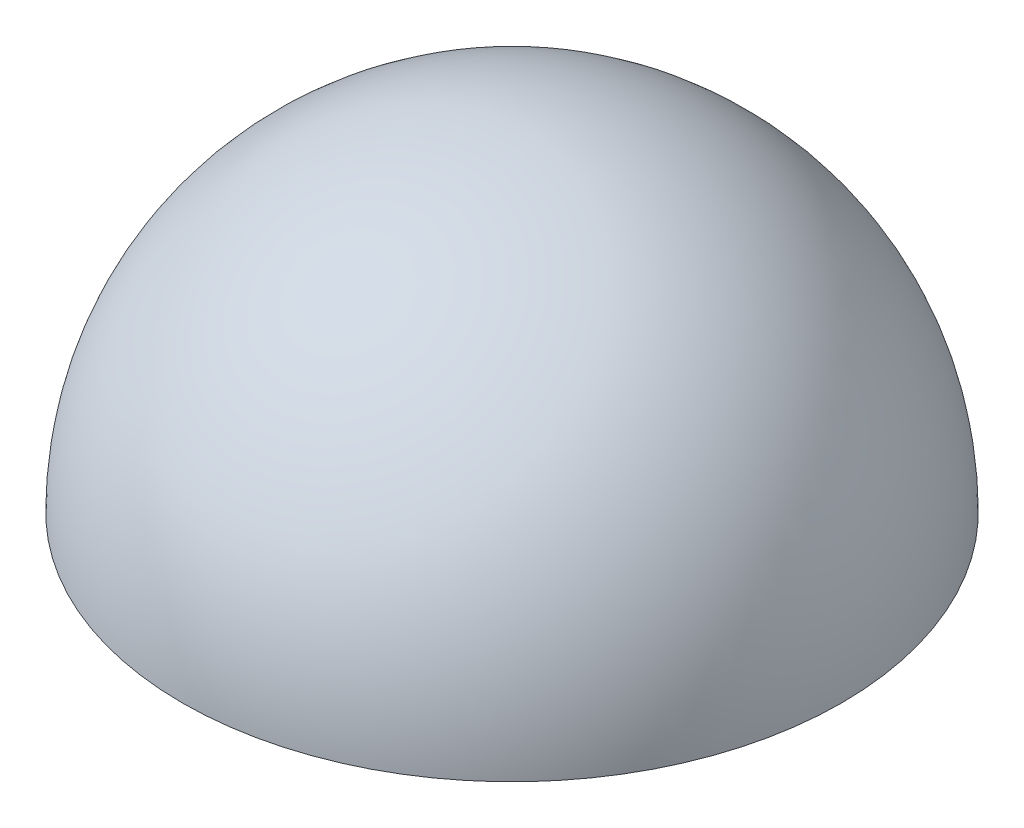
ISO-10303-21;
HEADER;
FILE_DESCRIPTION(('STEP AP214'),'2;1');
FILE_NAME('part.step','',(''),(''),'','','');
FILE_SCHEMA(('AUTOMOTIVE_DESIGN { 1 0 10303 214 1 1 1 1 }'));
ENDSEC;
DATA;
#1=APPLICATION_CONTEXT('core data for automotive mechanical design processes');
#2=APPLICATION_PROTOCOL_DEFINITION('international standard','automotive_design',2000,#1);
#3=PRODUCT_CONTEXT('',#1,'mechanical');
#4=PRODUCT('Part','Part','',(#3));
#5=PRODUCT_RELATED_PRODUCT_CATEGORY('part','',(#4));
#6=PRODUCT_DEFINITION_FORMATION('','',#4);
#7=PRODUCT_DEFINITION_CONTEXT('part definition',#1,'design');
#8=PRODUCT_DEFINITION('design','',#6,#7);
#9=PRODUCT_DEFINITION_SHAPE('','',#8);
#10=(LENGTH_UNIT() NAMED_UNIT(*) SI_UNIT(.MILLI.,.METRE.));
#11=(NAMED_UNIT(*) PLANE_ANGLE_UNIT() SI_UNIT($,.RADIAN.));
#12=(NAMED_UNIT(*) SI_UNIT($,.STERADIAN.) SOLID_ANGLE_UNIT());
#13=UNCERTAINTY_MEASURE_WITH_UNIT(LENGTH_MEASURE(1.E-05),#10,'distance_accuracy_value','');
#14=(GEOMETRIC_REPRESENTATION_CONTEXT(3) GLOBAL_UNCERTAINTY_ASSIGNED_CONTEXT((#13)) GLOBAL_UNIT_ASSIGNED_CONTEXT((#10,
#11,#12)) REPRESENTATION_CONTEXT('',''));
#15=CARTESIAN_POINT('',(0.,0.,0.));
#16=DIRECTION('',(0.,0.,1.));
#17=DIRECTION('',(1.,0.,0.));
#18=AXIS2_PLACEMENT_3D('',#15,#16,#17);
#19=CARTESIAN_POINT('',(0.,0.,0.));
#20=DIRECTION('',(0.,-1.,0.));
#21=DIRECTION('',(-1.,0.,0.));
#22=AXIS2_PLACEMENT_3D('',#19,#20,#21);
#23=SPHERICAL_SURFACE('',#22,37.084);
#24=CARTESIAN_POINT('',(0.,0.,0.));
#25=DIRECTION('',(0.,-1.,0.));
#26=DIRECTION('',(0.,0.,-1.));
#27=AXIS2_PLACEMENT_3D('',#24,#25,#26);
#28=CIRCLE('',#27,37.084);
#29=CARTESIAN_POINT('',(0.,0.,-37.084));
#30=VERTEX_POINT('',#29);
#31=EDGE_CURVE('E10',#30,#30,#28,.T.);
#32=ORIENTED_EDGE('',*,*,#31,.F.);
#33=EDGE_LOOP('',(#32));
#34=FACE_BOUND('',#33,.T.);
#35=ADVANCED_FACE('F39',(#34),#23,.T.);
#36=CARTESIAN_POINT('',(0.,0.,0.));
#37=DIRECTION('',(0.,-1.,0.));
#38=DIRECTION('',(0.,0.,-1.));
#39=AXIS2_PLACEMENT_3D('',#36,#37,#38);
#40=PLANE('',#39);
#41=ORIENTED_EDGE('',*,*,#31,.T.);
#42=EDGE_LOOP('',(#41));
#43=FACE_BOUND('',#42,.T.);
#44=ADVANCED_FACE('F47',(#43),#40,.T.);
#45=CLOSED_SHELL('',(#35,#44));
#46=MANIFOLD_SOLID_BREP('B2',#45);
#47=ADVANCED_BREP_SHAPE_REPRESENTATION('',(#18,#46),#14);
#48=SHAPE_DEFINITION_REPRESENTATION(#9,#47);
ENDSEC;
END-ISO-10303-21;
